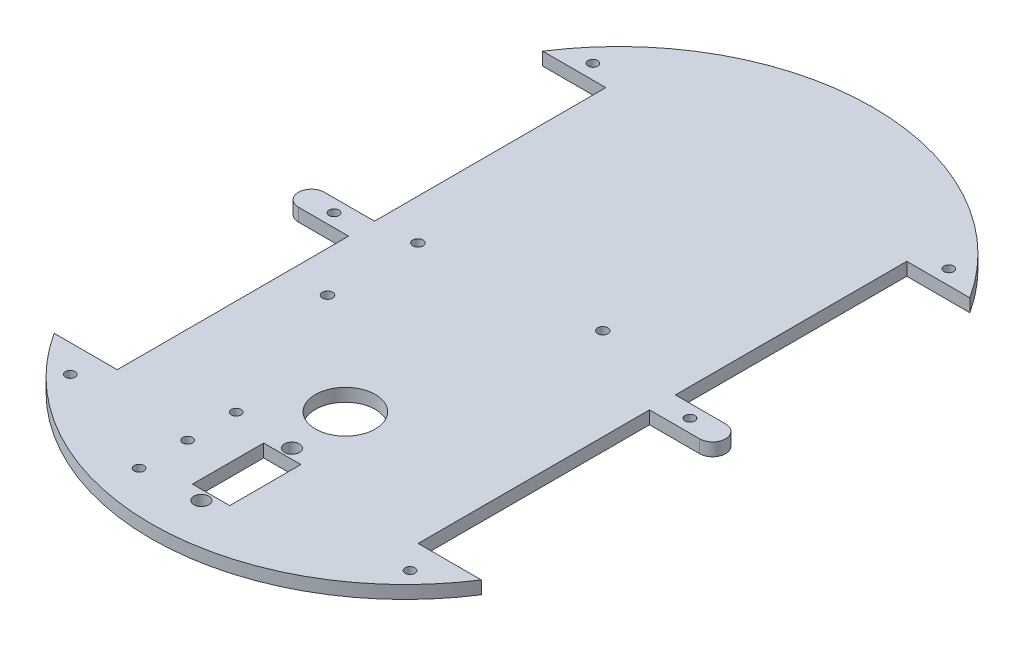
ISO-10303-21;
HEADER;
FILE_DESCRIPTION(('STEP AP214'),'2;1');
FILE_NAME('part.step','',(''),(''),'','','');
FILE_SCHEMA(('AUTOMOTIVE_DESIGN { 1 0 10303 214 1 1 1 1 }'));
ENDSEC;
DATA;
#1=APPLICATION_CONTEXT('core data for automotive mechanical design processes');
#2=APPLICATION_PROTOCOL_DEFINITION('international standard','automotive_design',2000,#1);
#3=PRODUCT_CONTEXT('',#1,'mechanical');
#4=PRODUCT('Part','Part','',(#3));
#5=PRODUCT_RELATED_PRODUCT_CATEGORY('part','',(#4));
#6=PRODUCT_DEFINITION_FORMATION('','',#4);
#7=PRODUCT_DEFINITION_CONTEXT('part definition',#1,'design');
#8=PRODUCT_DEFINITION('design','',#6,#7);
#9=PRODUCT_DEFINITION_SHAPE('','',#8);
#10=(LENGTH_UNIT() NAMED_UNIT(*) SI_UNIT(.MILLI.,.METRE.));
#11=(NAMED_UNIT(*) PLANE_ANGLE_UNIT() SI_UNIT($,.RADIAN.));
#12=(NAMED_UNIT(*) SI_UNIT($,.STERADIAN.) SOLID_ANGLE_UNIT());
#13=UNCERTAINTY_MEASURE_WITH_UNIT(LENGTH_MEASURE(1.E-05),#10,'distance_accuracy_value','');
#14=(GEOMETRIC_REPRESENTATION_CONTEXT(3) GLOBAL_UNCERTAINTY_ASSIGNED_CONTEXT((#13)) GLOBAL_UNIT_ASSIGNED_CONTEXT((#10,
#11,#12)) REPRESENTATION_CONTEXT('',''));
#15=CARTESIAN_POINT('',(0.,0.,0.));
#16=DIRECTION('',(0.,0.,1.));
#17=DIRECTION('',(1.,0.,0.));
#18=AXIS2_PLACEMENT_3D('',#15,#16,#17);
#19=CARTESIAN_POINT('',(62.,4.,4.));
#20=DIRECTION('',(0.,0.,-1.));
#21=DIRECTION('',(-1.,0.,0.));
#22=AXIS2_PLACEMENT_3D('',#19,#20,#21);
#23=PLANE('',#22);
#24=DIRECTION('',(1.,0.,0.));
#25=VECTOR('',#24,1.);
#26=CARTESIAN_POINT('',(62.,0.,4.));
#27=LINE('',#26,#25);
#28=CARTESIAN_POINT('',(46.5,0.,4.));
#29=VERTEX_POINT('',#28);
#30=CARTESIAN_POINT('',(62.,0.,4.));
#31=VERTEX_POINT('',#30);
#32=EDGE_CURVE('E253',#29,#31,#27,.T.);
#33=ORIENTED_EDGE('',*,*,#32,.T.);
#34=DIRECTION('',(0.,-1.,0.));
#35=VECTOR('',#34,1.);
#36=CARTESIAN_POINT('',(62.,4.,4.));
#37=LINE('',#36,#35);
#38=CARTESIAN_POINT('',(62.,4.,4.));
#39=VERTEX_POINT('',#38);
#40=EDGE_CURVE('E11',#39,#31,#37,.T.);
#41=ORIENTED_EDGE('',*,*,#40,.F.);
#42=DIRECTION('',(1.,0.,0.));
#43=VECTOR('',#42,1.);
#44=CARTESIAN_POINT('',(62.,4.,4.));
#45=LINE('',#44,#43);
#46=CARTESIAN_POINT('',(46.5,4.,4.));
#47=VERTEX_POINT('',#46);
#48=EDGE_CURVE('E256',#47,#39,#45,.T.);
#49=ORIENTED_EDGE('',*,*,#48,.F.);
#50=DIRECTION('',(0.,-1.,0.));
#51=VECTOR('',#50,1.);
#52=CARTESIAN_POINT('',(46.5,4.,4.));
#53=LINE('',#52,#51);
#54=EDGE_CURVE('E290',#47,#29,#53,.T.);
#55=ORIENTED_EDGE('',*,*,#54,.T.);
#56=EDGE_LOOP('',(#33,#41,#49,#55));
#57=FACE_BOUND('',#56,.T.);
#58=ADVANCED_FACE('F37',(#57),#23,.F.);
#59=CARTESIAN_POINT('',(62.,4.,0.));
#60=DIRECTION('',(0.,-1.,0.));
#61=DIRECTION('',(0.,0.,-1.));
#62=AXIS2_PLACEMENT_3D('',#59,#60,#61);
#63=CYLINDRICAL_SURFACE('',#62,4.);
#64=CARTESIAN_POINT('',(62.,0.,0.));
#65=DIRECTION('',(0.,1.,0.));
#66=DIRECTION('',(0.,0.,-1.));
#67=AXIS2_PLACEMENT_3D('',#64,#65,#66);
#68=CIRCLE('',#67,4.);
#69=CARTESIAN_POINT('',(62.,0.,-4.));
#70=VERTEX_POINT('',#69);
#71=EDGE_CURVE('E293',#31,#70,#68,.T.);
#72=ORIENTED_EDGE('',*,*,#71,.T.);
#73=DIRECTION('',(0.,-1.,0.));
#74=VECTOR('',#73,1.);
#75=CARTESIAN_POINT('',(62.,4.,-4.));
#76=LINE('',#75,#74);
#77=CARTESIAN_POINT('',(62.,4.,-4.));
#78=VERTEX_POINT('',#77);
#79=EDGE_CURVE('E44',#78,#70,#76,.T.);
#80=ORIENTED_EDGE('',*,*,#79,.F.);
#81=CARTESIAN_POINT('',(62.,4.,0.));
#82=DIRECTION('',(0.,1.,0.));
#83=DIRECTION('',(0.,0.,-1.));
#84=AXIS2_PLACEMENT_3D('',#81,#82,#83);
#85=CIRCLE('',#84,4.);
#86=EDGE_CURVE('E259',#39,#78,#85,.T.);
#87=ORIENTED_EDGE('',*,*,#86,.F.);
#88=ORIENTED_EDGE('',*,*,#40,.T.);
#89=EDGE_LOOP('',(#72,#80,#87,#88));
#90=FACE_BOUND('',#89,.T.);
#91=ADVANCED_FACE('F389',(#90),#63,.T.);
#92=CARTESIAN_POINT('',(62.,4.,-4.));
#93=DIRECTION('',(0.,0.,1.));
#94=DIRECTION('',(1.,0.,0.));
#95=AXIS2_PLACEMENT_3D('',#92,#93,#94);
#96=PLANE('',#95);
#97=DIRECTION('',(-1.,0.,0.));
#98=VECTOR('',#97,1.);
#99=CARTESIAN_POINT('',(62.,0.,-4.));
#100=LINE('',#99,#98);
#101=CARTESIAN_POINT('',(46.5,0.,-4.));
#102=VERTEX_POINT('',#101);
#103=EDGE_CURVE('E295',#70,#102,#100,.T.);
#104=ORIENTED_EDGE('',*,*,#103,.T.);
#105=DIRECTION('',(0.,-1.,0.));
#106=VECTOR('',#105,1.);
#107=CARTESIAN_POINT('',(46.5,4.,-4.));
#108=LINE('',#107,#106);
#109=CARTESIAN_POINT('',(46.5,4.,-4.));
#110=VERTEX_POINT('',#109);
#111=EDGE_CURVE('E360',#110,#102,#108,.T.);
#112=ORIENTED_EDGE('',*,*,#111,.F.);
#113=DIRECTION('',(-1.,0.,0.));
#114=VECTOR('',#113,1.);
#115=CARTESIAN_POINT('',(62.,4.,-4.));
#116=LINE('',#115,#114);
#117=EDGE_CURVE('E262',#78,#110,#116,.T.);
#118=ORIENTED_EDGE('',*,*,#117,.F.);
#119=ORIENTED_EDGE('',*,*,#79,.T.);
#120=EDGE_LOOP('',(#104,#112,#118,#119));
#121=FACE_BOUND('',#120,.T.);
#122=ADVANCED_FACE('F367',(#121),#96,.F.);
#123=CARTESIAN_POINT('',(46.5,4.,-4.));
#124=DIRECTION('',(-1.,0.,0.));
#125=DIRECTION('',(0.,0.,1.));
#126=AXIS2_PLACEMENT_3D('',#123,#124,#125);
#127=PLANE('',#126);
#128=DIRECTION('',(0.,0.,-1.));
#129=VECTOR('',#128,1.);
#130=CARTESIAN_POINT('',(46.5,0.,-4.));
#131=LINE('',#130,#129);
#132=CARTESIAN_POINT('',(46.5,0.,-75.5));
#133=VERTEX_POINT('',#132);
#134=EDGE_CURVE('E297',#102,#133,#131,.T.);
#135=ORIENTED_EDGE('',*,*,#134,.T.);
#136=DIRECTION('',(0.,-1.,0.));
#137=VECTOR('',#136,1.);
#138=CARTESIAN_POINT('',(46.5,4.,-75.5));
#139=LINE('',#138,#137);
#140=CARTESIAN_POINT('',(46.5,4.,-75.5));
#141=VERTEX_POINT('',#140);
#142=EDGE_CURVE('E357',#141,#133,#139,.T.);
#143=ORIENTED_EDGE('',*,*,#142,.F.);
#144=DIRECTION('',(0.,0.,-1.));
#145=VECTOR('',#144,1.);
#146=CARTESIAN_POINT('',(46.5,4.,-4.));
#147=LINE('',#146,#145);
#148=EDGE_CURVE('E264',#110,#141,#147,.T.);
#149=ORIENTED_EDGE('',*,*,#148,.F.);
#150=ORIENTED_EDGE('',*,*,#111,.T.);
#151=EDGE_LOOP('',(#135,#143,#149,#150));
#152=FACE_BOUND('',#151,.T.);
#153=ADVANCED_FACE('F377',(#152),#127,.F.);
#154=CARTESIAN_POINT('',(46.5,4.,-75.5));
#155=DIRECTION('',(0.,0.,-1.));
#156=DIRECTION('',(-1.,0.,0.));
#157=AXIS2_PLACEMENT_3D('',#154,#155,#156);
#158=PLANE('',#157);
#159=DIRECTION('',(1.,0.,0.));
#160=VECTOR('',#159,1.);
#161=CARTESIAN_POINT('',(46.5,0.,-75.5));
#162=LINE('',#161,#160);
#163=CARTESIAN_POINT('',(66.,0.,-75.5));
#164=VERTEX_POINT('',#163);
#165=EDGE_CURVE('E299',#133,#164,#162,.T.);
#166=ORIENTED_EDGE('',*,*,#165,.T.);
#167=DIRECTION('',(0.,-1.,0.));
#168=VECTOR('',#167,1.);
#169=CARTESIAN_POINT('',(66.,4.,-75.5));
#170=LINE('',#169,#168);
#171=CARTESIAN_POINT('',(66.,4.,-75.5));
#172=VERTEX_POINT('',#171);
#173=EDGE_CURVE('E354',#172,#164,#170,.T.);
#174=ORIENTED_EDGE('',*,*,#173,.F.);
#175=DIRECTION('',(1.,0.,0.));
#176=VECTOR('',#175,1.);
#177=CARTESIAN_POINT('',(46.5,4.,-75.5));
#178=LINE('',#177,#176);
#179=EDGE_CURVE('E266',#141,#172,#178,.T.);
#180=ORIENTED_EDGE('',*,*,#179,.F.);
#181=ORIENTED_EDGE('',*,*,#142,.T.);
#182=EDGE_LOOP('',(#166,#174,#180,#181));
#183=FACE_BOUND('',#182,.T.);
#184=ADVANCED_FACE('F381',(#183),#158,.F.);
#185=CARTESIAN_POINT('',(0.,4.,-33.));
#186=DIRECTION('',(0.,-1.,0.));
#187=DIRECTION('',(0.,0.,-1.));
#188=AXIS2_PLACEMENT_3D('',#185,#186,#187);
#189=CYLINDRICAL_SURFACE('',#188,78.5);
#190=CARTESIAN_POINT('',(0.,0.,-33.));
#191=DIRECTION('',(0.,1.,0.));
#192=DIRECTION('',(0.,0.,1.));
#193=AXIS2_PLACEMENT_3D('',#190,#191,#192);
#194=CIRCLE('',#193,78.5);
#195=CARTESIAN_POINT('',(-66.,0.,-75.5));
#196=VERTEX_POINT('',#195);
#197=EDGE_CURVE('E301',#164,#196,#194,.T.);
#198=ORIENTED_EDGE('',*,*,#197,.T.);
#199=DIRECTION('',(0.,-1.,0.));
#200=VECTOR('',#199,1.);
#201=CARTESIAN_POINT('',(-66.,4.,-75.5));
#202=LINE('',#201,#200);
#203=CARTESIAN_POINT('',(-66.,4.,-75.5));
#204=VERTEX_POINT('',#203);
#205=EDGE_CURVE('E351',#204,#196,#202,.T.);
#206=ORIENTED_EDGE('',*,*,#205,.F.);
#207=CARTESIAN_POINT('',(0.,4.,-33.));
#208=DIRECTION('',(0.,1.,0.));
#209=DIRECTION('',(0.,0.,1.));
#210=AXIS2_PLACEMENT_3D('',#207,#208,#209);
#211=CIRCLE('',#210,78.5);
#212=EDGE_CURVE('E268',#172,#204,#211,.T.);
#213=ORIENTED_EDGE('',*,*,#212,.F.);
#214=ORIENTED_EDGE('',*,*,#173,.T.);
#215=EDGE_LOOP('',(#198,#206,#213,#214));
#216=FACE_BOUND('',#215,.T.);
#217=ADVANCED_FACE('F442',(#216),#189,.T.);
#218=CARTESIAN_POINT('',(-46.5,4.,-75.5));
#219=DIRECTION('',(0.,0.,-1.));
#220=DIRECTION('',(-1.,0.,0.));
#221=AXIS2_PLACEMENT_3D('',#218,#219,#220);
#222=PLANE('',#221);
#223=DIRECTION('',(1.,0.,0.));
#224=VECTOR('',#223,1.);
#225=CARTESIAN_POINT('',(-46.5,0.,-75.5));
#226=LINE('',#225,#224);
#227=CARTESIAN_POINT('',(-46.5,0.,-75.5));
#228=VERTEX_POINT('',#227);
#229=EDGE_CURVE('E303',#196,#228,#226,.T.);
#230=ORIENTED_EDGE('',*,*,#229,.T.);
#231=DIRECTION('',(0.,-1.,0.));
#232=VECTOR('',#231,1.);
#233=CARTESIAN_POINT('',(-46.5,4.,-75.5));
#234=LINE('',#233,#232);
#235=CARTESIAN_POINT('',(-46.5,4.,-75.5));
#236=VERTEX_POINT('',#235);
#237=EDGE_CURVE('E348',#236,#228,#234,.T.);
#238=ORIENTED_EDGE('',*,*,#237,.F.);
#239=DIRECTION('',(1.,0.,0.));
#240=VECTOR('',#239,1.);
#241=CARTESIAN_POINT('',(-46.5,4.,-75.5));
#242=LINE('',#241,#240);
#243=EDGE_CURVE('E270',#204,#236,#242,.T.);
#244=ORIENTED_EDGE('',*,*,#243,.F.);
#245=ORIENTED_EDGE('',*,*,#205,.T.);
#246=EDGE_LOOP('',(#230,#238,#244,#245));
#247=FACE_BOUND('',#246,.T.);
#248=ADVANCED_FACE('F439',(#247),#222,.F.);
#249=CARTESIAN_POINT('',(-46.5,4.,-4.));
#250=DIRECTION('',(1.,0.,0.));
#251=DIRECTION('',(0.,0.,-1.));
#252=AXIS2_PLACEMENT_3D('',#249,#250,#251);
#253=PLANE('',#252);
#254=DIRECTION('',(0.,0.,1.));
#255=VECTOR('',#254,1.);
#256=CARTESIAN_POINT('',(-46.5,0.,-4.));
#257=LINE('',#256,#255);
#258=CARTESIAN_POINT('',(-46.5,0.,-4.));
#259=VERTEX_POINT('',#258);
#260=EDGE_CURVE('E305',#228,#259,#257,.T.);
#261=ORIENTED_EDGE('',*,*,#260,.T.);
#262=DIRECTION('',(0.,-1.,0.));
#263=VECTOR('',#262,1.);
#264=CARTESIAN_POINT('',(-46.5,4.,-4.));
#265=LINE('',#264,#263);
#266=CARTESIAN_POINT('',(-46.5,4.,-4.));
#267=VERTEX_POINT('',#266);
#268=EDGE_CURVE('E345',#267,#259,#265,.T.);
#269=ORIENTED_EDGE('',*,*,#268,.F.);
#270=DIRECTION('',(0.,0.,1.));
#271=VECTOR('',#270,1.);
#272=CARTESIAN_POINT('',(-46.5,4.,-4.));
#273=LINE('',#272,#271);
#274=EDGE_CURVE('E272',#236,#267,#273,.T.);
#275=ORIENTED_EDGE('',*,*,#274,.F.);
#276=ORIENTED_EDGE('',*,*,#237,.T.);
#277=EDGE_LOOP('',(#261,#269,#275,#276));
#278=FACE_BOUND('',#277,.T.);
#279=ADVANCED_FACE('F435',(#278),#253,.F.);
#280=CARTESIAN_POINT('',(-62.,4.,-4.));
#281=DIRECTION('',(0.,0.,1.));
#282=DIRECTION('',(1.,0.,0.));
#283=AXIS2_PLACEMENT_3D('',#280,#281,#282);
#284=PLANE('',#283);
#285=DIRECTION('',(-1.,0.,0.));
#286=VECTOR('',#285,1.);
#287=CARTESIAN_POINT('',(-62.,0.,-4.));
#288=LINE('',#287,#286);
#289=CARTESIAN_POINT('',(-62.,0.,-4.));
#290=VERTEX_POINT('',#289);
#291=EDGE_CURVE('E307',#259,#290,#288,.T.);
#292=ORIENTED_EDGE('',*,*,#291,.T.);
#293=DIRECTION('',(0.,-1.,0.));
#294=VECTOR('',#293,1.);
#295=CARTESIAN_POINT('',(-62.,4.,-4.));
#296=LINE('',#295,#294);
#297=CARTESIAN_POINT('',(-62.,4.,-4.));
#298=VERTEX_POINT('',#297);
#299=EDGE_CURVE('E342',#298,#290,#296,.T.);
#300=ORIENTED_EDGE('',*,*,#299,.F.);
#301=DIRECTION('',(-1.,0.,0.));
#302=VECTOR('',#301,1.);
#303=CARTESIAN_POINT('',(-62.,4.,-4.));
#304=LINE('',#303,#302);
#305=EDGE_CURVE('E274',#267,#298,#304,.T.);
#306=ORIENTED_EDGE('',*,*,#305,.F.);
#307=ORIENTED_EDGE('',*,*,#268,.T.);
#308=EDGE_LOOP('',(#292,#300,#306,#307));
#309=FACE_BOUND('',#308,.T.);
#310=ADVANCED_FACE('F431',(#309),#284,.F.);
#311=CARTESIAN_POINT('',(-62.,4.,0.));
#312=DIRECTION('',(0.,-1.,0.));
#313=DIRECTION('',(0.,0.,-1.));
#314=AXIS2_PLACEMENT_3D('',#311,#312,#313);
#315=CYLINDRICAL_SURFACE('',#314,4.);
#316=CARTESIAN_POINT('',(-62.,0.,0.));
#317=DIRECTION('',(0.,1.,0.));
#318=DIRECTION('',(0.,0.,1.));
#319=AXIS2_PLACEMENT_3D('',#316,#317,#318);
#320=CIRCLE('',#319,4.);
#321=CARTESIAN_POINT('',(-62.,0.,4.));
#322=VERTEX_POINT('',#321);
#323=EDGE_CURVE('E309',#290,#322,#320,.T.);
#324=ORIENTED_EDGE('',*,*,#323,.T.);
#325=DIRECTION('',(0.,-1.,0.));
#326=VECTOR('',#325,1.);
#327=CARTESIAN_POINT('',(-62.,4.,4.));
#328=LINE('',#327,#326);
#329=CARTESIAN_POINT('',(-62.,4.,4.));
#330=VERTEX_POINT('',#329);
#331=EDGE_CURVE('E339',#330,#322,#328,.T.);
#332=ORIENTED_EDGE('',*,*,#331,.F.);
#333=CARTESIAN_POINT('',(-62.,4.,0.));
#334=DIRECTION('',(0.,1.,0.));
#335=DIRECTION('',(0.,0.,1.));
#336=AXIS2_PLACEMENT_3D('',#333,#334,#335);
#337=CIRCLE('',#336,4.);
#338=EDGE_CURVE('E276',#298,#330,#337,.T.);
#339=ORIENTED_EDGE('',*,*,#338,.F.);
#340=ORIENTED_EDGE('',*,*,#299,.T.);
#341=EDGE_LOOP('',(#324,#332,#339,#340));
#342=FACE_BOUND('',#341,.T.);
#343=ADVANCED_FACE('F426',(#342),#315,.T.);
#344=CARTESIAN_POINT('',(-62.,4.,4.));
#345=DIRECTION('',(0.,0.,-1.));
#346=DIRECTION('',(-1.,0.,0.));
#347=AXIS2_PLACEMENT_3D('',#344,#345,#346);
#348=PLANE('',#347);
#349=DIRECTION('',(1.,0.,0.));
#350=VECTOR('',#349,1.);
#351=CARTESIAN_POINT('',(-62.,0.,4.));
#352=LINE('',#351,#350);
#353=CARTESIAN_POINT('',(-46.5,0.,4.));
#354=VERTEX_POINT('',#353);
#355=EDGE_CURVE('E311',#322,#354,#352,.T.);
#356=ORIENTED_EDGE('',*,*,#355,.T.);
#357=DIRECTION('',(0.,-1.,0.));
#358=VECTOR('',#357,1.);
#359=CARTESIAN_POINT('',(-46.5,4.,4.));
#360=LINE('',#359,#358);
#361=CARTESIAN_POINT('',(-46.5,4.,4.));
#362=VERTEX_POINT('',#361);
#363=EDGE_CURVE('E336',#362,#354,#360,.T.);
#364=ORIENTED_EDGE('',*,*,#363,.F.);
#365=DIRECTION('',(1.,0.,0.));
#366=VECTOR('',#365,1.);
#367=CARTESIAN_POINT('',(-62.,4.,4.));
#368=LINE('',#367,#366);
#369=EDGE_CURVE('E278',#330,#362,#368,.T.);
#370=ORIENTED_EDGE('',*,*,#369,.F.);
#371=ORIENTED_EDGE('',*,*,#331,.T.);
#372=EDGE_LOOP('',(#356,#364,#370,#371));
#373=FACE_BOUND('',#372,.T.);
#374=ADVANCED_FACE('F420',(#373),#348,.F.);
#375=CARTESIAN_POINT('',(-46.5,4.,4.));
#376=DIRECTION('',(1.,0.,0.));
#377=DIRECTION('',(0.,0.,-1.));
#378=AXIS2_PLACEMENT_3D('',#375,#376,#377);
#379=PLANE('',#378);
#380=DIRECTION('',(0.,0.,1.));
#381=VECTOR('',#380,1.);
#382=CARTESIAN_POINT('',(-46.5,0.,4.));
#383=LINE('',#382,#381);
#384=CARTESIAN_POINT('',(-46.5,0.,75.5));
#385=VERTEX_POINT('',#384);
#386=EDGE_CURVE('E313',#354,#385,#383,.T.);
#387=ORIENTED_EDGE('',*,*,#386,.T.);
#388=DIRECTION('',(0.,-1.,0.));
#389=VECTOR('',#388,1.);
#390=CARTESIAN_POINT('',(-46.5,4.,75.5));
#391=LINE('',#390,#389);
#392=CARTESIAN_POINT('',(-46.5,4.,75.5));
#393=VERTEX_POINT('',#392);
#394=EDGE_CURVE('E333',#393,#385,#391,.T.);
#395=ORIENTED_EDGE('',*,*,#394,.F.);
#396=DIRECTION('',(0.,0.,1.));
#397=VECTOR('',#396,1.);
#398=CARTESIAN_POINT('',(-46.5,4.,4.));
#399=LINE('',#398,#397);
#400=EDGE_CURVE('E280',#362,#393,#399,.T.);
#401=ORIENTED_EDGE('',*,*,#400,.F.);
#402=ORIENTED_EDGE('',*,*,#363,.T.);
#403=EDGE_LOOP('',(#387,#395,#401,#402));
#404=FACE_BOUND('',#403,.T.);
#405=ADVANCED_FACE('F416',(#404),#379,.F.);
#406=CARTESIAN_POINT('',(-46.5,4.,75.5));
#407=DIRECTION('',(0.,0.,1.));
#408=DIRECTION('',(1.,0.,0.));
#409=AXIS2_PLACEMENT_3D('',#406,#407,#408);
#410=PLANE('',#409);
#411=DIRECTION('',(-1.,0.,0.));
#412=VECTOR('',#411,1.);
#413=CARTESIAN_POINT('',(-46.5,0.,75.5));
#414=LINE('',#413,#412);
#415=CARTESIAN_POINT('',(-66.,0.,75.5));
#416=VERTEX_POINT('',#415);
#417=EDGE_CURVE('E315',#385,#416,#414,.T.);
#418=ORIENTED_EDGE('',*,*,#417,.T.);
#419=DIRECTION('',(0.,-1.,0.));
#420=VECTOR('',#419,1.);
#421=CARTESIAN_POINT('',(-66.,4.,75.5));
#422=LINE('',#421,#420);
#423=CARTESIAN_POINT('',(-66.,4.,75.5));
#424=VERTEX_POINT('',#423);
#425=EDGE_CURVE('E330',#424,#416,#422,.T.);
#426=ORIENTED_EDGE('',*,*,#425,.F.);
#427=DIRECTION('',(-1.,0.,0.));
#428=VECTOR('',#427,1.);
#429=CARTESIAN_POINT('',(-46.5,4.,75.5));
#430=LINE('',#429,#428);
#431=EDGE_CURVE('E282',#393,#424,#430,.T.);
#432=ORIENTED_EDGE('',*,*,#431,.F.);
#433=ORIENTED_EDGE('',*,*,#394,.T.);
#434=EDGE_LOOP('',(#418,#426,#432,#433));
#435=FACE_BOUND('',#434,.T.);
#436=ADVANCED_FACE('F411',(#435),#410,.F.);
#437=CARTESIAN_POINT('',(0.,4.,33.));
#438=DIRECTION('',(0.,-1.,0.));
#439=DIRECTION('',(0.,0.,-1.));
#440=AXIS2_PLACEMENT_3D('',#437,#438,#439);
#441=CYLINDRICAL_SURFACE('',#440,78.5);
#442=CARTESIAN_POINT('',(0.,0.,33.));
#443=DIRECTION('',(0.,1.,0.));
#444=DIRECTION('',(0.,0.,-1.));
#445=AXIS2_PLACEMENT_3D('',#442,#443,#444);
#446=CIRCLE('',#445,78.5);
#447=CARTESIAN_POINT('',(66.,0.,75.5));
#448=VERTEX_POINT('',#447);
#449=EDGE_CURVE('E317',#416,#448,#446,.T.);
#450=ORIENTED_EDGE('',*,*,#449,.T.);
#451=DIRECTION('',(0.,-1.,0.));
#452=VECTOR('',#451,1.);
#453=CARTESIAN_POINT('',(66.,4.,75.5));
#454=LINE('',#453,#452);
#455=CARTESIAN_POINT('',(66.,4.,75.5));
#456=VERTEX_POINT('',#455);
#457=EDGE_CURVE('E327',#456,#448,#454,.T.);
#458=ORIENTED_EDGE('',*,*,#457,.F.);
#459=CARTESIAN_POINT('',(0.,4.,33.));
#460=DIRECTION('',(0.,1.,0.));
#461=DIRECTION('',(0.,0.,-1.));
#462=AXIS2_PLACEMENT_3D('',#459,#460,#461);
#463=CIRCLE('',#462,78.5);
#464=EDGE_CURVE('E284',#424,#456,#463,.T.);
#465=ORIENTED_EDGE('',*,*,#464,.F.);
#466=ORIENTED_EDGE('',*,*,#425,.T.);
#467=EDGE_LOOP('',(#450,#458,#465,#466));
#468=FACE_BOUND('',#467,.T.);
#469=ADVANCED_FACE('F405',(#468),#441,.T.);
#470=CARTESIAN_POINT('',(46.5,4.,75.5));
#471=DIRECTION('',(0.,0.,1.));
#472=DIRECTION('',(1.,0.,0.));
#473=AXIS2_PLACEMENT_3D('',#470,#471,#472);
#474=PLANE('',#473);
#475=DIRECTION('',(-1.,0.,0.));
#476=VECTOR('',#475,1.);
#477=CARTESIAN_POINT('',(46.5,0.,75.5));
#478=LINE('',#477,#476);
#479=CARTESIAN_POINT('',(46.5,0.,75.5));
#480=VERTEX_POINT('',#479);
#481=EDGE_CURVE('E319',#448,#480,#478,.T.);
#482=ORIENTED_EDGE('',*,*,#481,.T.);
#483=DIRECTION('',(0.,-1.,0.));
#484=VECTOR('',#483,1.);
#485=CARTESIAN_POINT('',(46.5,4.,75.5));
#486=LINE('',#485,#484);
#487=CARTESIAN_POINT('',(46.5,4.,75.5));
#488=VERTEX_POINT('',#487);
#489=EDGE_CURVE('E324',#488,#480,#486,.T.);
#490=ORIENTED_EDGE('',*,*,#489,.F.);
#491=DIRECTION('',(-1.,0.,0.));
#492=VECTOR('',#491,1.);
#493=CARTESIAN_POINT('',(46.5,4.,75.5));
#494=LINE('',#493,#492);
#495=EDGE_CURVE('E286',#456,#488,#494,.T.);
#496=ORIENTED_EDGE('',*,*,#495,.F.);
#497=ORIENTED_EDGE('',*,*,#457,.T.);
#498=EDGE_LOOP('',(#482,#490,#496,#497));
#499=FACE_BOUND('',#498,.T.);
#500=ADVANCED_FACE('F401',(#499),#474,.F.);
#501=CARTESIAN_POINT('',(46.5,4.,4.));
#502=DIRECTION('',(-1.,0.,0.));
#503=DIRECTION('',(0.,0.,1.));
#504=AXIS2_PLACEMENT_3D('',#501,#502,#503);
#505=PLANE('',#504);
#506=DIRECTION('',(0.,0.,-1.));
#507=VECTOR('',#506,1.);
#508=CARTESIAN_POINT('',(46.5,0.,4.));
#509=LINE('',#508,#507);
#510=EDGE_CURVE('E260',#480,#29,#509,.T.);
#511=ORIENTED_EDGE('',*,*,#510,.T.);
#512=ORIENTED_EDGE('',*,*,#54,.F.);
#513=DIRECTION('',(0.,0.,-1.));
#514=VECTOR('',#513,1.);
#515=CARTESIAN_POINT('',(46.5,4.,4.));
#516=LINE('',#515,#514);
#517=EDGE_CURVE('E288',#488,#47,#516,.T.);
#518=ORIENTED_EDGE('',*,*,#517,.F.);
#519=ORIENTED_EDGE('',*,*,#489,.T.);
#520=EDGE_LOOP('',(#511,#512,#518,#519));
#521=FACE_BOUND('',#520,.T.);
#522=ADVANCED_FACE('F396',(#521),#505,.F.);
#523=CARTESIAN_POINT('',(0.,4.,33.));
#524=DIRECTION('',(0.,-1.,0.));
#525=DIRECTION('',(0.,0.,-1.));
#526=AXIS2_PLACEMENT_3D('',#523,#524,#525);
#527=PLANE('',#526);
#528=CARTESIAN_POINT('',(-33.96,4.,-4.88));
#529=DIRECTION('',(0.,1.,0.));
#530=DIRECTION('',(0.,0.,1.));
#531=AXIS2_PLACEMENT_3D('',#528,#529,#530);
#532=CIRCLE('',#531,1.59);
#533=CARTESIAN_POINT('',(-33.96,4.,-3.29));
#534=VERTEX_POINT('',#533);
#535=EDGE_CURVE('E764',#534,#534,#532,.T.);
#536=ORIENTED_EDGE('',*,*,#535,.F.);
#537=EDGE_LOOP('',(#536));
#538=FACE_BOUND('',#537,.T.);
#539=CARTESIAN_POINT('',(18.11,4.,-9.96000000000001));
#540=DIRECTION('',(0.,1.,0.));
#541=DIRECTION('',(0.,0.,1.));
#542=AXIS2_PLACEMENT_3D('',#539,#540,#541);
#543=CIRCLE('',#542,1.59);
#544=CARTESIAN_POINT('',(18.11,4.,-8.37000000000001));
#545=VERTEX_POINT('',#544);
#546=EDGE_CURVE('E770',#545,#545,#543,.T.);
#547=ORIENTED_EDGE('',*,*,#546,.F.);
#548=EDGE_LOOP('',(#547));
#549=FACE_BOUND('',#548,.T.);
#550=CARTESIAN_POINT('',(-33.96,4.,23.06));
#551=DIRECTION('',(0.,1.,0.));
#552=DIRECTION('',(0.,0.,1.));
#553=AXIS2_PLACEMENT_3D('',#550,#551,#552);
#554=CIRCLE('',#553,1.59);
#555=CARTESIAN_POINT('',(-33.96,4.,24.65));
#556=VERTEX_POINT('',#555);
#557=EDGE_CURVE('E765',#556,#556,#554,.T.);
#558=ORIENTED_EDGE('',*,*,#557,.F.);
#559=EDGE_LOOP('',(#558));
#560=FACE_BOUND('',#559,.T.);
#561=CARTESIAN_POINT('',(0.,4.,51.5));
#562=DIRECTION('',(0.,1.,0.));
#563=DIRECTION('',(0.,0.,1.));
#564=AXIS2_PLACEMENT_3D('',#561,#562,#563);
#565=CIRCLE('',#564,9.25);
#566=CARTESIAN_POINT('',(0.,4.,60.75));
#567=VERTEX_POINT('',#566);
#568=EDGE_CURVE('E779',#567,#567,#565,.T.);
#569=ORIENTED_EDGE('',*,*,#568,.F.);
#570=EDGE_LOOP('',(#569));
#571=FACE_BOUND('',#570,.T.);
#572=CARTESIAN_POINT('',(-16.7500000000001,4.,68.5));
#573=DIRECTION('',(0.,1.,0.));
#574=DIRECTION('',(0.,0.,1.));
#575=AXIS2_PLACEMENT_3D('',#572,#573,#574);
#576=CIRCLE('',#575,1.5);
#577=CARTESIAN_POINT('',(-16.7500000000001,4.,70.));
#578=VERTEX_POINT('',#577);
#579=EDGE_CURVE('E790',#578,#578,#576,.T.);
#580=ORIENTED_EDGE('',*,*,#579,.F.);
#581=EDGE_LOOP('',(#580));
#582=FACE_BOUND('',#581,.T.);
#583=CARTESIAN_POINT('',(-16.75,4.,83.5));
#584=DIRECTION('',(0.,1.,0.));
#585=DIRECTION('',(0.,0.,1.));
#586=AXIS2_PLACEMENT_3D('',#583,#584,#585);
#587=CIRCLE('',#586,1.5);
#588=CARTESIAN_POINT('',(-16.75,4.,85.));
#589=VERTEX_POINT('',#588);
#590=EDGE_CURVE('E784',#589,#589,#587,.T.);
#591=ORIENTED_EDGE('',*,*,#590,.F.);
#592=EDGE_LOOP('',(#591));
#593=FACE_BOUND('',#592,.T.);
#594=DIRECTION('',(-1.,0.,0.));
#595=VECTOR('',#594,1.);
#596=CARTESIAN_POINT('',(7.25,4.,72.5));
#597=LINE('',#596,#595);
#598=CARTESIAN_POINT('',(7.25,4.,72.5));
#599=VERTEX_POINT('',#598);
#600=CARTESIAN_POINT('',(-4.25,4.,72.5));
#601=VERTEX_POINT('',#600);
#602=EDGE_CURVE('E203',#599,#601,#597,.T.);
#603=ORIENTED_EDGE('',*,*,#602,.F.);
#604=DIRECTION('',(0.,0.,-1.));
#605=VECTOR('',#604,1.);
#606=CARTESIAN_POINT('',(7.25,4.,72.5));
#607=LINE('',#606,#605);
#608=CARTESIAN_POINT('',(7.25,4.,94.5));
#609=VERTEX_POINT('',#608);
#610=EDGE_CURVE('E51',#609,#599,#607,.T.);
#611=ORIENTED_EDGE('',*,*,#610,.F.);
#612=DIRECTION('',(1.,0.,0.));
#613=VECTOR('',#612,1.);
#614=CARTESIAN_POINT('',(7.25,4.,94.5));
#615=LINE('',#614,#613);
#616=CARTESIAN_POINT('',(-4.25,4.,94.5));
#617=VERTEX_POINT('',#616);
#618=EDGE_CURVE('E191',#617,#609,#615,.T.);
#619=ORIENTED_EDGE('',*,*,#618,.F.);
#620=DIRECTION('',(0.,0.,1.));
#621=VECTOR('',#620,1.);
#622=CARTESIAN_POINT('',(-4.25,4.,72.5));
#623=LINE('',#622,#621);
#624=EDGE_CURVE('E194',#601,#617,#623,.T.);
#625=ORIENTED_EDGE('',*,*,#624,.F.);
#626=EDGE_LOOP('',(#603,#611,#619,#625));
#627=FACE_BOUND('',#626,.T.);
#628=CARTESIAN_POINT('',(1.5,4.,69.5));
#629=DIRECTION('',(0.,1.,0.));
#630=DIRECTION('',(0.,0.,1.));
#631=AXIS2_PLACEMENT_3D('',#628,#629,#630);
#632=CIRCLE('',#631,2.31);
#633=CARTESIAN_POINT('',(1.5,4.,71.81));
#634=VERTEX_POINT('',#633);
#635=EDGE_CURVE('E800',#634,#634,#632,.T.);
#636=ORIENTED_EDGE('',*,*,#635,.F.);
#637=EDGE_LOOP('',(#636));
#638=FACE_BOUND('',#637,.T.);
#639=CARTESIAN_POINT('',(1.5,4.,97.5));
#640=DIRECTION('',(0.,1.,0.));
#641=DIRECTION('',(0.,0.,-1.));
#642=AXIS2_PLACEMENT_3D('',#639,#640,#641);
#643=CIRCLE('',#642,2.31);
#644=CARTESIAN_POINT('',(1.5,4.,95.19));
#645=VERTEX_POINT('',#644);
#646=EDGE_CURVE('E197',#645,#645,#643,.T.);
#647=ORIENTED_EDGE('',*,*,#646,.F.);
#648=EDGE_LOOP('',(#647));
#649=FACE_BOUND('',#648,.T.);
#650=CARTESIAN_POINT('',(-16.75,4.,98.5));
#651=DIRECTION('',(0.,1.,0.));
#652=DIRECTION('',(0.,0.,1.));
#653=AXIS2_PLACEMENT_3D('',#650,#651,#652);
#654=CIRCLE('',#653,1.5);
#655=CARTESIAN_POINT('',(-16.75,4.,100.));
#656=VERTEX_POINT('',#655);
#657=EDGE_CURVE('E210',#656,#656,#654,.T.);
#658=ORIENTED_EDGE('',*,*,#657,.F.);
#659=EDGE_LOOP('',(#658));
#660=FACE_BOUND('',#659,.T.);
#661=CARTESIAN_POINT('',(52.5,4.,84.));
#662=DIRECTION('',(0.,1.,0.));
#663=DIRECTION('',(0.,0.,1.));
#664=AXIS2_PLACEMENT_3D('',#661,#662,#663);
#665=CIRCLE('',#664,1.5);
#666=CARTESIAN_POINT('',(52.5,4.,85.5));
#667=VERTEX_POINT('',#666);
#668=EDGE_CURVE('E224',#667,#667,#665,.T.);
#669=ORIENTED_EDGE('',*,*,#668,.F.);
#670=EDGE_LOOP('',(#669));
#671=FACE_BOUND('',#670,.T.);
#672=CARTESIAN_POINT('',(55.,4.,0.));
#673=DIRECTION('',(0.,1.,0.));
#674=DIRECTION('',(0.,0.,1.));
#675=AXIS2_PLACEMENT_3D('',#672,#673,#674);
#676=CIRCLE('',#675,1.5);
#677=CARTESIAN_POINT('',(55.,4.,1.5));
#678=VERTEX_POINT('',#677);
#679=EDGE_CURVE('E230',#678,#678,#676,.T.);
#680=ORIENTED_EDGE('',*,*,#679,.F.);
#681=EDGE_LOOP('',(#680));
#682=FACE_BOUND('',#681,.T.);
#683=CARTESIAN_POINT('',(-55.,4.,-80.));
#684=DIRECTION('',(0.,1.,0.));
#685=DIRECTION('',(0.,0.,-1.));
#686=AXIS2_PLACEMENT_3D('',#683,#684,#685);
#687=CIRCLE('',#686,1.5);
#688=CARTESIAN_POINT('',(-55.,4.,-81.5));
#689=VERTEX_POINT('',#688);
#690=EDGE_CURVE('E236',#689,#689,#687,.T.);
#691=ORIENTED_EDGE('',*,*,#690,.F.);
#692=EDGE_LOOP('',(#691));
#693=FACE_BOUND('',#692,.T.);
#694=CARTESIAN_POINT('',(-55.,4.,0.));
#695=DIRECTION('',(0.,1.,0.));
#696=DIRECTION('',(0.,0.,-1.));
#697=AXIS2_PLACEMENT_3D('',#694,#695,#696);
#698=CIRCLE('',#697,1.5);
#699=CARTESIAN_POINT('',(-55.,4.,-1.5));
#700=VERTEX_POINT('',#699);
#701=EDGE_CURVE('E242',#700,#700,#698,.T.);
#702=ORIENTED_EDGE('',*,*,#701,.F.);
#703=EDGE_LOOP('',(#702));
#704=FACE_BOUND('',#703,.T.);
#705=CARTESIAN_POINT('',(-52.5,4.,84.));
#706=DIRECTION('',(0.,1.,0.));
#707=DIRECTION('',(0.,0.,-1.));
#708=AXIS2_PLACEMENT_3D('',#705,#706,#707);
#709=CIRCLE('',#708,1.5);
#710=CARTESIAN_POINT('',(-52.5,4.,82.5));
#711=VERTEX_POINT('',#710);
#712=EDGE_CURVE('E217',#711,#711,#709,.T.);
#713=ORIENTED_EDGE('',*,*,#712,.F.);
#714=EDGE_LOOP('',(#713));
#715=FACE_BOUND('',#714,.T.);
#716=CARTESIAN_POINT('',(55.,4.,-80.));
#717=DIRECTION('',(0.,1.,0.));
#718=DIRECTION('',(0.,0.,1.));
#719=AXIS2_PLACEMENT_3D('',#716,#717,#718);
#720=CIRCLE('',#719,1.5);
#721=CARTESIAN_POINT('',(55.,4.,-78.5));
#722=VERTEX_POINT('',#721);
#723=EDGE_CURVE('E223',#722,#722,#720,.T.);
#724=ORIENTED_EDGE('',*,*,#723,.F.);
#725=EDGE_LOOP('',(#724));
#726=FACE_BOUND('',#725,.T.);
#727=ORIENTED_EDGE('',*,*,#48,.T.);
#728=ORIENTED_EDGE('',*,*,#86,.T.);
#729=ORIENTED_EDGE('',*,*,#117,.T.);
#730=ORIENTED_EDGE('',*,*,#148,.T.);
#731=ORIENTED_EDGE('',*,*,#179,.T.);
#732=ORIENTED_EDGE('',*,*,#212,.T.);
#733=ORIENTED_EDGE('',*,*,#243,.T.);
#734=ORIENTED_EDGE('',*,*,#274,.T.);
#735=ORIENTED_EDGE('',*,*,#305,.T.);
#736=ORIENTED_EDGE('',*,*,#338,.T.);
#737=ORIENTED_EDGE('',*,*,#369,.T.);
#738=ORIENTED_EDGE('',*,*,#400,.T.);
#739=ORIENTED_EDGE('',*,*,#431,.T.);
#740=ORIENTED_EDGE('',*,*,#464,.T.);
#741=ORIENTED_EDGE('',*,*,#495,.T.);
#742=ORIENTED_EDGE('',*,*,#517,.T.);
#743=EDGE_LOOP('',(#727,#728,#729,#730,#731,#732,#733,#734,#735,#736,#737,#738,#739,#740,#741,#742));
#744=FACE_BOUND('',#743,.T.);
#745=ADVANCED_FACE('F385',(#538,#549,#560,#571,#582,#593,#627,#638,#649,#660,#671,#682,#693,
#704,#715,#726,#744),#527,.F.);
#746=CARTESIAN_POINT('',(0.,0.,33.));
#747=DIRECTION('',(0.,-1.,0.));
#748=DIRECTION('',(0.,0.,-1.));
#749=AXIS2_PLACEMENT_3D('',#746,#747,#748);
#750=PLANE('',#749);
#751=CARTESIAN_POINT('',(-33.96,0.,-4.88));
#752=DIRECTION('',(0.,1.,0.));
#753=DIRECTION('',(0.,0.,1.));
#754=AXIS2_PLACEMENT_3D('',#751,#752,#753);
#755=CIRCLE('',#754,1.59);
#756=CARTESIAN_POINT('',(-33.96,0.,-3.29));
#757=VERTEX_POINT('',#756);
#758=EDGE_CURVE('E761',#757,#757,#755,.T.);
#759=ORIENTED_EDGE('',*,*,#758,.T.);
#760=EDGE_LOOP('',(#759));
#761=FACE_BOUND('',#760,.T.);
#762=CARTESIAN_POINT('',(18.11,0.,-9.96000000000001));
#763=DIRECTION('',(0.,1.,0.));
#764=DIRECTION('',(0.,0.,1.));
#765=AXIS2_PLACEMENT_3D('',#762,#763,#764);
#766=CIRCLE('',#765,1.59);
#767=CARTESIAN_POINT('',(18.11,0.,-8.37000000000001));
#768=VERTEX_POINT('',#767);
#769=EDGE_CURVE('E775',#768,#768,#766,.T.);
#770=ORIENTED_EDGE('',*,*,#769,.T.);
#771=EDGE_LOOP('',(#770));
#772=FACE_BOUND('',#771,.T.);
#773=CARTESIAN_POINT('',(-33.96,0.,23.06));
#774=DIRECTION('',(0.,1.,0.));
#775=DIRECTION('',(0.,0.,1.));
#776=AXIS2_PLACEMENT_3D('',#773,#774,#775);
#777=CIRCLE('',#776,1.59);
#778=CARTESIAN_POINT('',(-33.96,0.,24.65));
#779=VERTEX_POINT('',#778);
#780=EDGE_CURVE('E768',#779,#779,#777,.T.);
#781=ORIENTED_EDGE('',*,*,#780,.T.);
#782=EDGE_LOOP('',(#781));
#783=FACE_BOUND('',#782,.T.);
#784=CARTESIAN_POINT('',(0.,0.,51.5));
#785=DIRECTION('',(0.,1.,0.));
#786=DIRECTION('',(0.,0.,1.));
#787=AXIS2_PLACEMENT_3D('',#784,#785,#786);
#788=CIRCLE('',#787,9.25);
#789=CARTESIAN_POINT('',(0.,0.,60.75));
#790=VERTEX_POINT('',#789);
#791=EDGE_CURVE('E793',#790,#790,#788,.T.);
#792=ORIENTED_EDGE('',*,*,#791,.T.);
#793=EDGE_LOOP('',(#792));
#794=FACE_BOUND('',#793,.T.);
#795=CARTESIAN_POINT('',(-16.7500000000001,0.,68.5));
#796=DIRECTION('',(0.,1.,0.));
#797=DIRECTION('',(0.,0.,1.));
#798=AXIS2_PLACEMENT_3D('',#795,#796,#797);
#799=CIRCLE('',#798,1.5);
#800=CARTESIAN_POINT('',(-16.7500000000001,0.,70.));
#801=VERTEX_POINT('',#800);
#802=EDGE_CURVE('E787',#801,#801,#799,.T.);
#803=ORIENTED_EDGE('',*,*,#802,.T.);
#804=EDGE_LOOP('',(#803));
#805=FACE_BOUND('',#804,.T.);
#806=CARTESIAN_POINT('',(-16.75,0.,83.5));
#807=DIRECTION('',(0.,1.,0.));
#808=DIRECTION('',(0.,0.,1.));
#809=AXIS2_PLACEMENT_3D('',#806,#807,#808);
#810=CIRCLE('',#809,1.5);
#811=CARTESIAN_POINT('',(-16.75,0.,85.));
#812=VERTEX_POINT('',#811);
#813=EDGE_CURVE('E781',#812,#812,#810,.T.);
#814=ORIENTED_EDGE('',*,*,#813,.T.);
#815=EDGE_LOOP('',(#814));
#816=FACE_BOUND('',#815,.T.);
#817=DIRECTION('',(0.,0.,-1.));
#818=VECTOR('',#817,1.);
#819=CARTESIAN_POINT('',(7.25,0.,72.5));
#820=LINE('',#819,#818);
#821=CARTESIAN_POINT('',(7.25,0.,94.5));
#822=VERTEX_POINT('',#821);
#823=CARTESIAN_POINT('',(7.25,0.,72.5));
#824=VERTEX_POINT('',#823);
#825=EDGE_CURVE('E175',#822,#824,#820,.T.);
#826=ORIENTED_EDGE('',*,*,#825,.T.);
#827=DIRECTION('',(-1.,0.,0.));
#828=VECTOR('',#827,1.);
#829=CARTESIAN_POINT('',(7.25,0.,72.5));
#830=LINE('',#829,#828);
#831=CARTESIAN_POINT('',(-4.25,0.,72.5));
#832=VERTEX_POINT('',#831);
#833=EDGE_CURVE('E184',#824,#832,#830,.T.);
#834=ORIENTED_EDGE('',*,*,#833,.T.);
#835=DIRECTION('',(0.,0.,1.));
#836=VECTOR('',#835,1.);
#837=CARTESIAN_POINT('',(-4.25,0.,72.5));
#838=LINE('',#837,#836);
#839=CARTESIAN_POINT('',(-4.25,0.,94.5));
#840=VERTEX_POINT('',#839);
#841=EDGE_CURVE('E59',#832,#840,#838,.T.);
#842=ORIENTED_EDGE('',*,*,#841,.T.);
#843=DIRECTION('',(1.,0.,0.));
#844=VECTOR('',#843,1.);
#845=CARTESIAN_POINT('',(7.25,0.,94.5));
#846=LINE('',#845,#844);
#847=EDGE_CURVE('E181',#840,#822,#846,.T.);
#848=ORIENTED_EDGE('',*,*,#847,.T.);
#849=EDGE_LOOP('',(#826,#834,#842,#848));
#850=FACE_BOUND('',#849,.T.);
#851=CARTESIAN_POINT('',(1.5,0.,69.5));
#852=DIRECTION('',(0.,1.,0.));
#853=DIRECTION('',(0.,0.,1.));
#854=AXIS2_PLACEMENT_3D('',#851,#852,#853);
#855=CIRCLE('',#854,2.31);
#856=CARTESIAN_POINT('',(1.5,0.,71.81));
#857=VERTEX_POINT('',#856);
#858=EDGE_CURVE('E204',#857,#857,#855,.T.);
#859=ORIENTED_EDGE('',*,*,#858,.T.);
#860=EDGE_LOOP('',(#859));
#861=FACE_BOUND('',#860,.T.);
#862=CARTESIAN_POINT('',(1.5,0.,97.5));
#863=DIRECTION('',(0.,1.,0.));
#864=DIRECTION('',(0.,0.,-1.));
#865=AXIS2_PLACEMENT_3D('',#862,#863,#864);
#866=CIRCLE('',#865,2.31);
#867=CARTESIAN_POINT('',(1.5,0.,95.19));
#868=VERTEX_POINT('',#867);
#869=EDGE_CURVE('E802',#868,#868,#866,.T.);
#870=ORIENTED_EDGE('',*,*,#869,.T.);
#871=EDGE_LOOP('',(#870));
#872=FACE_BOUND('',#871,.T.);
#873=CARTESIAN_POINT('',(-16.75,0.,98.5));
#874=DIRECTION('',(0.,1.,0.));
#875=DIRECTION('',(0.,0.,1.));
#876=AXIS2_PLACEMENT_3D('',#873,#874,#875);
#877=CIRCLE('',#876,1.5);
#878=CARTESIAN_POINT('',(-16.75,0.,100.));
#879=VERTEX_POINT('',#878);
#880=EDGE_CURVE('E214',#879,#879,#877,.T.);
#881=ORIENTED_EDGE('',*,*,#880,.T.);
#882=EDGE_LOOP('',(#881));
#883=FACE_BOUND('',#882,.T.);
#884=CARTESIAN_POINT('',(52.5,0.,84.));
#885=DIRECTION('',(0.,1.,0.));
#886=DIRECTION('',(0.,0.,1.));
#887=AXIS2_PLACEMENT_3D('',#884,#885,#886);
#888=CIRCLE('',#887,1.5);
#889=CARTESIAN_POINT('',(52.5,0.,85.5));
#890=VERTEX_POINT('',#889);
#891=EDGE_CURVE('E220',#890,#890,#888,.T.);
#892=ORIENTED_EDGE('',*,*,#891,.T.);
#893=EDGE_LOOP('',(#892));
#894=FACE_BOUND('',#893,.T.);
#895=CARTESIAN_POINT('',(55.,0.,0.));
#896=DIRECTION('',(0.,1.,0.));
#897=DIRECTION('',(0.,0.,1.));
#898=AXIS2_PLACEMENT_3D('',#895,#896,#897);
#899=CIRCLE('',#898,1.5);
#900=CARTESIAN_POINT('',(55.,0.,1.5));
#901=VERTEX_POINT('',#900);
#902=EDGE_CURVE('E227',#901,#901,#899,.T.);
#903=ORIENTED_EDGE('',*,*,#902,.T.);
#904=EDGE_LOOP('',(#903));
#905=FACE_BOUND('',#904,.T.);
#906=CARTESIAN_POINT('',(-55.,0.,-80.));
#907=DIRECTION('',(0.,1.,0.));
#908=DIRECTION('',(0.,0.,-1.));
#909=AXIS2_PLACEMENT_3D('',#906,#907,#908);
#910=CIRCLE('',#909,1.5);
#911=CARTESIAN_POINT('',(-55.,0.,-81.5));
#912=VERTEX_POINT('',#911);
#913=EDGE_CURVE('E233',#912,#912,#910,.T.);
#914=ORIENTED_EDGE('',*,*,#913,.T.);
#915=EDGE_LOOP('',(#914));
#916=FACE_BOUND('',#915,.T.);
#917=CARTESIAN_POINT('',(-55.,0.,0.));
#918=DIRECTION('',(0.,1.,0.));
#919=DIRECTION('',(0.,0.,-1.));
#920=AXIS2_PLACEMENT_3D('',#917,#918,#919);
#921=CIRCLE('',#920,1.5);
#922=CARTESIAN_POINT('',(-55.,0.,-1.5));
#923=VERTEX_POINT('',#922);
#924=EDGE_CURVE('E239',#923,#923,#921,.T.);
#925=ORIENTED_EDGE('',*,*,#924,.T.);
#926=EDGE_LOOP('',(#925));
#927=FACE_BOUND('',#926,.T.);
#928=CARTESIAN_POINT('',(-52.5,0.,84.));
#929=DIRECTION('',(0.,1.,0.));
#930=DIRECTION('',(0.,0.,-1.));
#931=AXIS2_PLACEMENT_3D('',#928,#929,#930);
#932=CIRCLE('',#931,1.5);
#933=CARTESIAN_POINT('',(-52.5,0.,82.5));
#934=VERTEX_POINT('',#933);
#935=EDGE_CURVE('E245',#934,#934,#932,.T.);
#936=ORIENTED_EDGE('',*,*,#935,.T.);
#937=EDGE_LOOP('',(#936));
#938=FACE_BOUND('',#937,.T.);
#939=CARTESIAN_POINT('',(55.,0.,-80.));
#940=DIRECTION('',(0.,1.,0.));
#941=DIRECTION('',(0.,0.,1.));
#942=AXIS2_PLACEMENT_3D('',#939,#940,#941);
#943=CIRCLE('',#942,1.5);
#944=CARTESIAN_POINT('',(55.,0.,-78.5));
#945=VERTEX_POINT('',#944);
#946=EDGE_CURVE('E250',#945,#945,#943,.T.);
#947=ORIENTED_EDGE('',*,*,#946,.T.);
#948=EDGE_LOOP('',(#947));
#949=FACE_BOUND('',#948,.T.);
#950=ORIENTED_EDGE('',*,*,#32,.F.);
#951=ORIENTED_EDGE('',*,*,#510,.F.);
#952=ORIENTED_EDGE('',*,*,#481,.F.);
#953=ORIENTED_EDGE('',*,*,#449,.F.);
#954=ORIENTED_EDGE('',*,*,#417,.F.);
#955=ORIENTED_EDGE('',*,*,#386,.F.);
#956=ORIENTED_EDGE('',*,*,#355,.F.);
#957=ORIENTED_EDGE('',*,*,#323,.F.);
#958=ORIENTED_EDGE('',*,*,#291,.F.);
#959=ORIENTED_EDGE('',*,*,#260,.F.);
#960=ORIENTED_EDGE('',*,*,#229,.F.);
#961=ORIENTED_EDGE('',*,*,#197,.F.);
#962=ORIENTED_EDGE('',*,*,#165,.F.);
#963=ORIENTED_EDGE('',*,*,#134,.F.);
#964=ORIENTED_EDGE('',*,*,#103,.F.);
#965=ORIENTED_EDGE('',*,*,#71,.F.);
#966=EDGE_LOOP('',(#950,#951,#952,#953,#954,#955,#956,#957,#958,#959,#960,#961,#962,#963,#964,#965));
#967=FACE_BOUND('',#966,.T.);
#968=ADVANCED_FACE('F188',(#761,#772,#783,#794,#805,#816,#850,#861,#872,#883,#894,#905,#916,
#927,#938,#949,#967),#750,.T.);
#969=CARTESIAN_POINT('',(55.,0.,-80.));
#970=DIRECTION('',(0.,1.,0.));
#971=DIRECTION('',(0.,0.,1.));
#972=AXIS2_PLACEMENT_3D('',#969,#970,#971);
#973=CYLINDRICAL_SURFACE('',#972,1.5);
#974=ORIENTED_EDGE('',*,*,#946,.F.);
#975=EDGE_LOOP('',(#974));
#976=FACE_BOUND('',#975,.T.);
#977=ORIENTED_EDGE('',*,*,#723,.T.);
#978=EDGE_LOOP('',(#977));
#979=FACE_BOUND('',#978,.T.);
#980=ADVANCED_FACE('F558',(#976,#979),#973,.F.);
#981=CARTESIAN_POINT('',(-52.5,0.,84.));
#982=DIRECTION('',(0.,1.,0.));
#983=DIRECTION('',(0.,0.,1.));
#984=AXIS2_PLACEMENT_3D('',#981,#982,#983);
#985=CYLINDRICAL_SURFACE('',#984,1.5);
#986=ORIENTED_EDGE('',*,*,#935,.F.);
#987=EDGE_LOOP('',(#986));
#988=FACE_BOUND('',#987,.T.);
#989=ORIENTED_EDGE('',*,*,#712,.T.);
#990=EDGE_LOOP('',(#989));
#991=FACE_BOUND('',#990,.T.);
#992=ADVANCED_FACE('F563',(#988,#991),#985,.F.);
#993=CARTESIAN_POINT('',(-55.,0.,0.));
#994=DIRECTION('',(0.,1.,0.));
#995=DIRECTION('',(0.,0.,1.));
#996=AXIS2_PLACEMENT_3D('',#993,#994,#995);
#997=CYLINDRICAL_SURFACE('',#996,1.5);
#998=ORIENTED_EDGE('',*,*,#924,.F.);
#999=EDGE_LOOP('',(#998));
#1000=FACE_BOUND('',#999,.T.);
#1001=ORIENTED_EDGE('',*,*,#701,.T.);
#1002=EDGE_LOOP('',(#1001));
#1003=FACE_BOUND('',#1002,.T.);
#1004=ADVANCED_FACE('F575',(#1000,#1003),#997,.F.);
#1005=CARTESIAN_POINT('',(-55.,0.,-80.));
#1006=DIRECTION('',(0.,1.,0.));
#1007=DIRECTION('',(0.,0.,1.));
#1008=AXIS2_PLACEMENT_3D('',#1005,#1006,#1007);
#1009=CYLINDRICAL_SURFACE('',#1008,1.5);
#1010=ORIENTED_EDGE('',*,*,#913,.F.);
#1011=EDGE_LOOP('',(#1010));
#1012=FACE_BOUND('',#1011,.T.);
#1013=ORIENTED_EDGE('',*,*,#690,.T.);
#1014=EDGE_LOOP('',(#1013));
#1015=FACE_BOUND('',#1014,.T.);
#1016=ADVANCED_FACE('F585',(#1012,#1015),#1009,.F.);
#1017=CARTESIAN_POINT('',(55.,0.,0.));
#1018=DIRECTION('',(0.,1.,0.));
#1019=DIRECTION('',(0.,0.,1.));
#1020=AXIS2_PLACEMENT_3D('',#1017,#1018,#1019);
#1021=CYLINDRICAL_SURFACE('',#1020,1.5);
#1022=ORIENTED_EDGE('',*,*,#902,.F.);
#1023=EDGE_LOOP('',(#1022));
#1024=FACE_BOUND('',#1023,.T.);
#1025=ORIENTED_EDGE('',*,*,#679,.T.);
#1026=EDGE_LOOP('',(#1025));
#1027=FACE_BOUND('',#1026,.T.);
#1028=ADVANCED_FACE('F595',(#1024,#1027),#1021,.F.);
#1029=CARTESIAN_POINT('',(52.5,0.,84.));
#1030=DIRECTION('',(0.,1.,0.));
#1031=DIRECTION('',(0.,0.,1.));
#1032=AXIS2_PLACEMENT_3D('',#1029,#1030,#1031);
#1033=CYLINDRICAL_SURFACE('',#1032,1.5);
#1034=ORIENTED_EDGE('',*,*,#891,.F.);
#1035=EDGE_LOOP('',(#1034));
#1036=FACE_BOUND('',#1035,.T.);
#1037=ORIENTED_EDGE('',*,*,#668,.T.);
#1038=EDGE_LOOP('',(#1037));
#1039=FACE_BOUND('',#1038,.T.);
#1040=ADVANCED_FACE('F605',(#1036,#1039),#1033,.F.);
#1041=CARTESIAN_POINT('',(-16.75,0.,98.5));
#1042=DIRECTION('',(0.,1.,0.));
#1043=DIRECTION('',(0.,0.,1.));
#1044=AXIS2_PLACEMENT_3D('',#1041,#1042,#1043);
#1045=CYLINDRICAL_SURFACE('',#1044,1.5);
#1046=ORIENTED_EDGE('',*,*,#880,.F.);
#1047=EDGE_LOOP('',(#1046));
#1048=FACE_BOUND('',#1047,.T.);
#1049=ORIENTED_EDGE('',*,*,#657,.T.);
#1050=EDGE_LOOP('',(#1049));
#1051=FACE_BOUND('',#1050,.T.);
#1052=ADVANCED_FACE('F615',(#1048,#1051),#1045,.F.);
#1053=CARTESIAN_POINT('',(1.5,0.,97.5));
#1054=DIRECTION('',(0.,1.,0.));
#1055=DIRECTION('',(0.,0.,1.));
#1056=AXIS2_PLACEMENT_3D('',#1053,#1054,#1055);
#1057=CYLINDRICAL_SURFACE('',#1056,2.31);
#1058=ORIENTED_EDGE('',*,*,#869,.F.);
#1059=EDGE_LOOP('',(#1058));
#1060=FACE_BOUND('',#1059,.T.);
#1061=ORIENTED_EDGE('',*,*,#646,.T.);
#1062=EDGE_LOOP('',(#1061));
#1063=FACE_BOUND('',#1062,.T.);
#1064=ADVANCED_FACE('F625',(#1060,#1063),#1057,.F.);
#1065=CARTESIAN_POINT('',(1.5,0.,69.5));
#1066=DIRECTION('',(0.,1.,0.));
#1067=DIRECTION('',(0.,0.,1.));
#1068=AXIS2_PLACEMENT_3D('',#1065,#1066,#1067);
#1069=CYLINDRICAL_SURFACE('',#1068,2.31);
#1070=ORIENTED_EDGE('',*,*,#858,.F.);
#1071=EDGE_LOOP('',(#1070));
#1072=FACE_BOUND('',#1071,.T.);
#1073=ORIENTED_EDGE('',*,*,#635,.T.);
#1074=EDGE_LOOP('',(#1073));
#1075=FACE_BOUND('',#1074,.T.);
#1076=ADVANCED_FACE('F635',(#1072,#1075),#1069,.F.);
#1077=CARTESIAN_POINT('',(7.25,0.,72.5));
#1078=DIRECTION('',(1.,0.,0.));
#1079=DIRECTION('',(0.,0.,-1.));
#1080=AXIS2_PLACEMENT_3D('',#1077,#1078,#1079);
#1081=PLANE('',#1080);
#1082=ORIENTED_EDGE('',*,*,#610,.T.);
#1083=DIRECTION('',(0.,1.,0.));
#1084=VECTOR('',#1083,1.);
#1085=CARTESIAN_POINT('',(7.25,0.,72.5));
#1086=LINE('',#1085,#1084);
#1087=EDGE_CURVE('E171',#824,#599,#1086,.T.);
#1088=ORIENTED_EDGE('',*,*,#1087,.F.);
#1089=ORIENTED_EDGE('',*,*,#825,.F.);
#1090=DIRECTION('',(0.,1.,0.));
#1091=VECTOR('',#1090,1.);
#1092=CARTESIAN_POINT('',(7.25,0.,94.5));
#1093=LINE('',#1092,#1091);
#1094=EDGE_CURVE('E208',#822,#609,#1093,.T.);
#1095=ORIENTED_EDGE('',*,*,#1094,.T.);
#1096=EDGE_LOOP('',(#1082,#1088,#1089,#1095));
#1097=FACE_BOUND('',#1096,.T.);
#1098=ADVANCED_FACE('F173',(#1097),#1081,.F.);
#1099=CARTESIAN_POINT('',(7.25,0.,94.5));
#1100=DIRECTION('',(0.,0.,1.));
#1101=DIRECTION('',(1.,0.,0.));
#1102=AXIS2_PLACEMENT_3D('',#1099,#1100,#1101);
#1103=PLANE('',#1102);
#1104=ORIENTED_EDGE('',*,*,#618,.T.);
#1105=ORIENTED_EDGE('',*,*,#1094,.F.);
#1106=ORIENTED_EDGE('',*,*,#847,.F.);
#1107=DIRECTION('',(0.,1.,0.));
#1108=VECTOR('',#1107,1.);
#1109=CARTESIAN_POINT('',(-4.25,0.,94.5));
#1110=LINE('',#1109,#1108);
#1111=EDGE_CURVE('E211',#840,#617,#1110,.T.);
#1112=ORIENTED_EDGE('',*,*,#1111,.T.);
#1113=EDGE_LOOP('',(#1104,#1105,#1106,#1112));
#1114=FACE_BOUND('',#1113,.T.);
#1115=ADVANCED_FACE('F654',(#1114),#1103,.F.);
#1116=CARTESIAN_POINT('',(-4.25,0.,72.5));
#1117=DIRECTION('',(-1.,0.,0.));
#1118=DIRECTION('',(0.,0.,1.));
#1119=AXIS2_PLACEMENT_3D('',#1116,#1117,#1118);
#1120=PLANE('',#1119);
#1121=ORIENTED_EDGE('',*,*,#624,.T.);
#1122=ORIENTED_EDGE('',*,*,#1111,.F.);
#1123=ORIENTED_EDGE('',*,*,#841,.F.);
#1124=DIRECTION('',(0.,1.,0.));
#1125=VECTOR('',#1124,1.);
#1126=CARTESIAN_POINT('',(-4.25,0.,72.5));
#1127=LINE('',#1126,#1125);
#1128=EDGE_CURVE('E180',#832,#601,#1127,.T.);
#1129=ORIENTED_EDGE('',*,*,#1128,.T.);
#1130=EDGE_LOOP('',(#1121,#1122,#1123,#1129));
#1131=FACE_BOUND('',#1130,.T.);
#1132=ADVANCED_FACE('F663',(#1131),#1120,.F.);
#1133=CARTESIAN_POINT('',(7.25,0.,72.5));
#1134=DIRECTION('',(0.,0.,-1.));
#1135=DIRECTION('',(-1.,0.,0.));
#1136=AXIS2_PLACEMENT_3D('',#1133,#1134,#1135);
#1137=PLANE('',#1136);
#1138=ORIENTED_EDGE('',*,*,#602,.T.);
#1139=ORIENTED_EDGE('',*,*,#1128,.F.);
#1140=ORIENTED_EDGE('',*,*,#833,.F.);
#1141=ORIENTED_EDGE('',*,*,#1087,.T.);
#1142=EDGE_LOOP('',(#1138,#1139,#1140,#1141));
#1143=FACE_BOUND('',#1142,.T.);
#1144=ADVANCED_FACE('F185',(#1143),#1137,.F.);
#1145=CARTESIAN_POINT('',(-16.75,0.,83.5));
#1146=DIRECTION('',(0.,1.,0.));
#1147=DIRECTION('',(0.,0.,1.));
#1148=AXIS2_PLACEMENT_3D('',#1145,#1146,#1147);
#1149=CYLINDRICAL_SURFACE('',#1148,1.5);
#1150=ORIENTED_EDGE('',*,*,#813,.F.);
#1151=EDGE_LOOP('',(#1150));
#1152=FACE_BOUND('',#1151,.T.);
#1153=ORIENTED_EDGE('',*,*,#590,.T.);
#1154=EDGE_LOOP('',(#1153));
#1155=FACE_BOUND('',#1154,.T.);
#1156=ADVANCED_FACE('F681',(#1152,#1155),#1149,.F.);
#1157=CARTESIAN_POINT('',(-16.7500000000001,0.,68.5));
#1158=DIRECTION('',(0.,1.,0.));
#1159=DIRECTION('',(0.,0.,1.));
#1160=AXIS2_PLACEMENT_3D('',#1157,#1158,#1159);
#1161=CYLINDRICAL_SURFACE('',#1160,1.5);
#1162=ORIENTED_EDGE('',*,*,#802,.F.);
#1163=EDGE_LOOP('',(#1162));
#1164=FACE_BOUND('',#1163,.T.);
#1165=ORIENTED_EDGE('',*,*,#579,.T.);
#1166=EDGE_LOOP('',(#1165));
#1167=FACE_BOUND('',#1166,.T.);
#1168=ADVANCED_FACE('F690',(#1164,#1167),#1161,.F.);
#1169=CARTESIAN_POINT('',(0.,0.,51.5));
#1170=DIRECTION('',(0.,1.,0.));
#1171=DIRECTION('',(0.,0.,1.));
#1172=AXIS2_PLACEMENT_3D('',#1169,#1170,#1171);
#1173=CYLINDRICAL_SURFACE('',#1172,9.25);
#1174=ORIENTED_EDGE('',*,*,#791,.F.);
#1175=EDGE_LOOP('',(#1174));
#1176=FACE_BOUND('',#1175,.T.);
#1177=ORIENTED_EDGE('',*,*,#568,.T.);
#1178=EDGE_LOOP('',(#1177));
#1179=FACE_BOUND('',#1178,.T.);
#1180=ADVANCED_FACE('F700',(#1176,#1179),#1173,.F.);
#1181=CARTESIAN_POINT('',(-33.96,0.,23.06));
#1182=DIRECTION('',(0.,1.,0.));
#1183=DIRECTION('',(0.,0.,1.));
#1184=AXIS2_PLACEMENT_3D('',#1181,#1182,#1183);
#1185=CYLINDRICAL_SURFACE('',#1184,1.59);
#1186=ORIENTED_EDGE('',*,*,#780,.F.);
#1187=EDGE_LOOP('',(#1186));
#1188=FACE_BOUND('',#1187,.T.);
#1189=ORIENTED_EDGE('',*,*,#557,.T.);
#1190=EDGE_LOOP('',(#1189));
#1191=FACE_BOUND('',#1190,.T.);
#1192=ADVANCED_FACE('F710',(#1188,#1191),#1185,.F.);
#1193=CARTESIAN_POINT('',(18.11,0.,-9.96000000000001));
#1194=DIRECTION('',(0.,1.,0.));
#1195=DIRECTION('',(0.,0.,1.));
#1196=AXIS2_PLACEMENT_3D('',#1193,#1194,#1195);
#1197=CYLINDRICAL_SURFACE('',#1196,1.59);
#1198=ORIENTED_EDGE('',*,*,#769,.F.);
#1199=EDGE_LOOP('',(#1198));
#1200=FACE_BOUND('',#1199,.T.);
#1201=ORIENTED_EDGE('',*,*,#546,.T.);
#1202=EDGE_LOOP('',(#1201));
#1203=FACE_BOUND('',#1202,.T.);
#1204=ADVANCED_FACE('F734',(#1200,#1203),#1197,.F.);
#1205=CARTESIAN_POINT('',(-33.96,0.,-4.88));
#1206=DIRECTION('',(0.,1.,0.));
#1207=DIRECTION('',(0.,0.,1.));
#1208=AXIS2_PLACEMENT_3D('',#1205,#1206,#1207);
#1209=CYLINDRICAL_SURFACE('',#1208,1.59);
#1210=ORIENTED_EDGE('',*,*,#758,.F.);
#1211=EDGE_LOOP('',(#1210));
#1212=FACE_BOUND('',#1211,.T.);
#1213=ORIENTED_EDGE('',*,*,#535,.T.);
#1214=EDGE_LOOP('',(#1213));
#1215=FACE_BOUND('',#1214,.T.);
#1216=ADVANCED_FACE('F744',(#1212,#1215),#1209,.F.);
#1217=CLOSED_SHELL('',(#58,#91,#122,#153,#184,#217,#248,#279,#310,#343,#374,#405,#436,#469,#500,
#522,#745,#968,#980,#992,#1004,#1016,#1028,#1040,#1052,#1064,#1076,#1098,#1115,#1132,#1144,
#1156,#1168,#1180,#1192,#1204,#1216));
#1218=MANIFOLD_SOLID_BREP('B2',#1217);
#1219=ADVANCED_BREP_SHAPE_REPRESENTATION('',(#18,#1218),#14);
#1220=SHAPE_DEFINITION_REPRESENTATION(#9,#1219);
ENDSEC;
END-ISO-10303-21;
